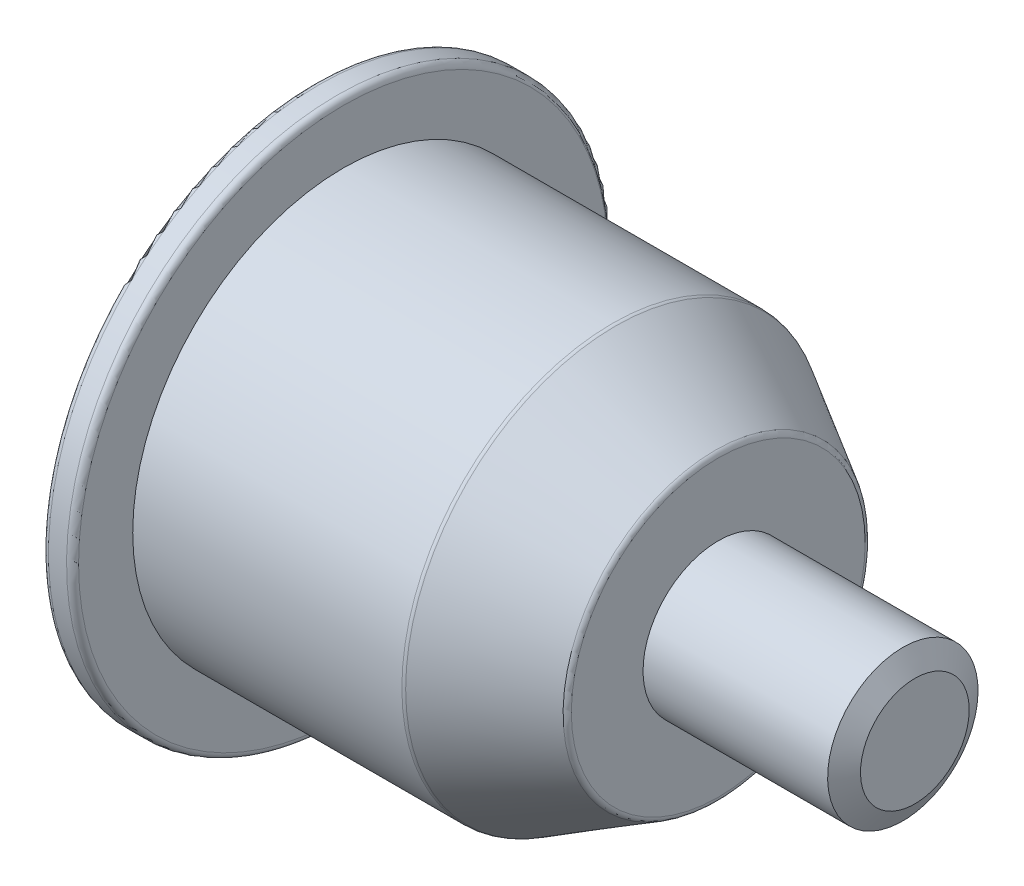
ISO-10303-21;
HEADER;
FILE_DESCRIPTION(('STEP AP214'),'2;1');
FILE_NAME('part.step','',(''),(''),'','','');
FILE_SCHEMA(('AUTOMOTIVE_DESIGN { 1 0 10303 214 1 1 1 1 }'));
ENDSEC;
DATA;
#1=APPLICATION_CONTEXT('core data for automotive mechanical design processes');
#2=APPLICATION_PROTOCOL_DEFINITION('international standard','automotive_design',2000,#1);
#3=PRODUCT_CONTEXT('',#1,'mechanical');
#4=PRODUCT('Part','Part','',(#3));
#5=PRODUCT_RELATED_PRODUCT_CATEGORY('part','',(#4));
#6=PRODUCT_DEFINITION_FORMATION('','',#4);
#7=PRODUCT_DEFINITION_CONTEXT('part definition',#1,'design');
#8=PRODUCT_DEFINITION('design','',#6,#7);
#9=PRODUCT_DEFINITION_SHAPE('','',#8);
#10=(LENGTH_UNIT() NAMED_UNIT(*) SI_UNIT(.MILLI.,.METRE.));
#11=(NAMED_UNIT(*) PLANE_ANGLE_UNIT() SI_UNIT($,.RADIAN.));
#12=(NAMED_UNIT(*) SI_UNIT($,.STERADIAN.) SOLID_ANGLE_UNIT());
#13=UNCERTAINTY_MEASURE_WITH_UNIT(LENGTH_MEASURE(1.E-05),#10,'distance_accuracy_value','');
#14=(GEOMETRIC_REPRESENTATION_CONTEXT(3) GLOBAL_UNCERTAINTY_ASSIGNED_CONTEXT((#13)) GLOBAL_UNIT_ASSIGNED_CONTEXT((#10,
#11,#12)) REPRESENTATION_CONTEXT('',''));
#15=CARTESIAN_POINT('',(0.,0.,0.));
#16=DIRECTION('',(0.,0.,1.));
#17=DIRECTION('',(1.,0.,0.));
#18=AXIS2_PLACEMENT_3D('',#15,#16,#17);
#19=CARTESIAN_POINT('',(0.,127.,0.));
#20=DIRECTION('',(-1.,0.,0.));
#21=DIRECTION('',(0.,-1.,0.));
#22=AXIS2_PLACEMENT_3D('',#19,#20,#21);
#23=PLANE('',#22);
#24=CARTESIAN_POINT('',(0.,0.,0.));
#25=DIRECTION('',(-1.,0.,0.));
#26=DIRECTION('',(0.,-1.,0.));
#27=AXIS2_PLACEMENT_3D('',#24,#25,#26);
#28=CIRCLE('',#27,139.7);
#29=CARTESIAN_POINT('',(0.,-139.7,0.));
#30=VERTEX_POINT('',#29);
#31=EDGE_CURVE('E51',#30,#30,#28,.F.);
#32=ORIENTED_EDGE('',*,*,#31,.T.);
#33=EDGE_LOOP('',(#32));
#34=FACE_BOUND('',#33,.T.);
#35=CARTESIAN_POINT('',(0.,0.,0.));
#36=DIRECTION('',(-1.,0.,0.));
#37=DIRECTION('',(0.,-1.,0.));
#38=AXIS2_PLACEMENT_3D('',#35,#36,#37);
#39=CIRCLE('',#38,223.52);
#40=CARTESIAN_POINT('',(0.,-223.52,0.));
#41=VERTEX_POINT('',#40);
#42=EDGE_CURVE('E77',#41,#41,#39,.T.);
#43=ORIENTED_EDGE('',*,*,#42,.T.);
#44=EDGE_LOOP('',(#43));
#45=FACE_BOUND('',#44,.T.);
#46=ADVANCED_FACE('F39',(#34,#45),#23,.T.);
#47=CARTESIAN_POINT('',(508.,0.,0.));
#48=DIRECTION('',(1.,0.,0.));
#49=DIRECTION('',(0.,1.,0.));
#50=AXIS2_PLACEMENT_3D('',#47,#48,#49);
#51=CYLINDRICAL_SURFACE('',#50,228.6);
#52=CARTESIAN_POINT('',(20.32,0.,0.));
#53=DIRECTION('',(1.,0.,0.));
#54=DIRECTION('',(0.,1.,0.));
#55=AXIS2_PLACEMENT_3D('',#52,#53,#54);
#56=CIRCLE('',#55,228.6);
#57=CARTESIAN_POINT('',(20.32,228.6,0.));
#58=VERTEX_POINT('',#57);
#59=EDGE_CURVE('E81',#58,#58,#56,.F.);
#60=ORIENTED_EDGE('',*,*,#59,.T.);
#61=EDGE_LOOP('',(#60));
#62=FACE_BOUND('',#61,.T.);
#63=CARTESIAN_POINT('',(5.07999999999997,0.,0.));
#64=DIRECTION('',(-1.,0.,0.));
#65=DIRECTION('',(0.,-1.,0.));
#66=AXIS2_PLACEMENT_3D('',#63,#64,#65);
#67=CIRCLE('',#66,228.6);
#68=CARTESIAN_POINT('',(5.07999999999997,-228.6,0.));
#69=VERTEX_POINT('',#68);
#70=EDGE_CURVE('E83',#69,#69,#67,.F.);
#71=ORIENTED_EDGE('',*,*,#70,.T.);
#72=EDGE_LOOP('',(#71));
#73=FACE_BOUND('',#72,.T.);
#74=ADVANCED_FACE('F130',(#62,#73),#51,.T.);
#75=CARTESIAN_POINT('',(25.4,228.6,0.));
#76=DIRECTION('',(1.,0.,0.));
#77=DIRECTION('',(0.,1.,0.));
#78=AXIS2_PLACEMENT_3D('',#75,#76,#77);
#79=PLANE('',#78);
#80=CARTESIAN_POINT('',(25.4,0.,0.));
#81=DIRECTION('',(1.,0.,0.));
#82=DIRECTION('',(0.,1.,0.));
#83=AXIS2_PLACEMENT_3D('',#80,#81,#82);
#84=CIRCLE('',#83,223.52);
#85=CARTESIAN_POINT('',(25.4,223.52,0.));
#86=VERTEX_POINT('',#85);
#87=EDGE_CURVE('E87',#86,#86,#84,.T.);
#88=ORIENTED_EDGE('',*,*,#87,.T.);
#89=EDGE_LOOP('',(#88));
#90=FACE_BOUND('',#89,.T.);
#91=CARTESIAN_POINT('',(25.4,0.,0.));
#92=DIRECTION('',(1.,0.,0.));
#93=DIRECTION('',(0.,1.,0.));
#94=AXIS2_PLACEMENT_3D('',#91,#92,#93);
#95=CIRCLE('',#94,177.8);
#96=CARTESIAN_POINT('',(25.4,177.8,0.));
#97=VERTEX_POINT('',#96);
#98=EDGE_CURVE('E105',#97,#97,#95,.T.);
#99=ORIENTED_EDGE('',*,*,#98,.F.);
#100=EDGE_LOOP('',(#99));
#101=FACE_BOUND('',#100,.T.);
#102=ADVANCED_FACE('F134',(#90,#101),#79,.T.);
#103=CARTESIAN_POINT('',(508.,0.,0.));
#104=DIRECTION('',(1.,0.,0.));
#105=DIRECTION('',(0.,1.,0.));
#106=AXIS2_PLACEMENT_3D('',#103,#104,#105);
#107=CYLINDRICAL_SURFACE('',#106,177.8);
#108=CARTESIAN_POINT('',(252.63881810245,0.,0.));
#109=DIRECTION('',(-1.,0.,0.));
#110=DIRECTION('',(0.,-1.,0.));
#111=AXIS2_PLACEMENT_3D('',#108,#109,#110);
#112=CIRCLE('',#111,177.8);
#113=CARTESIAN_POINT('',(252.63881810245,-177.8,0.));
#114=VERTEX_POINT('',#113);
#115=EDGE_CURVE('E89',#114,#114,#112,.T.);
#116=ORIENTED_EDGE('',*,*,#115,.T.);
#117=EDGE_LOOP('',(#116));
#118=FACE_BOUND('',#117,.T.);
#119=ORIENTED_EDGE('',*,*,#98,.T.);
#120=EDGE_LOOP('',(#119));
#121=FACE_BOUND('',#120,.T.);
#122=ADVANCED_FACE('F122',(#118,#121),#107,.T.);
#123=CARTESIAN_POINT('',(341.988181024499,0.,0.));
#124=DIRECTION('',(-1.,0.,0.));
#125=DIRECTION('',(0.,-1.,0.));
#126=AXIS2_PLACEMENT_3D('',#123,#124,#125);
#127=CONICAL_SURFACE('',#126,127.,0.5235987755983);
#128=CARTESIAN_POINT('',(339.448181024499,0.,0.));
#129=DIRECTION('',(1.,0.,0.));
#130=DIRECTION('',(0.,1.,0.));
#131=AXIS2_PLACEMENT_3D('',#128,#129,#130);
#132=CIRCLE('',#131,128.466469683742);
#133=CARTESIAN_POINT('',(339.448181024499,128.466469683742,0.));
#134=VERTEX_POINT('',#133);
#135=EDGE_CURVE('E91',#134,#134,#132,.F.);
#136=ORIENTED_EDGE('',*,*,#135,.T.);
#137=EDGE_LOOP('',(#136));
#138=FACE_BOUND('',#137,.T.);
#139=CARTESIAN_POINT('',(255.17881810245,0.,0.));
#140=DIRECTION('',(1.,0.,0.));
#141=DIRECTION('',(0.,1.,0.));
#142=AXIS2_PLACEMENT_3D('',#139,#140,#141);
#143=CIRCLE('',#142,177.119409051225);
#144=CARTESIAN_POINT('',(255.17881810245,177.119409051225,0.));
#145=VERTEX_POINT('',#144);
#146=EDGE_CURVE('E96',#145,#145,#143,.T.);
#147=ORIENTED_EDGE('',*,*,#146,.T.);
#148=EDGE_LOOP('',(#147));
#149=FACE_BOUND('',#148,.T.);
#150=ADVANCED_FACE('F114',(#138,#149),#127,.T.);
#151=CARTESIAN_POINT('',(341.988181024499,63.5,0.));
#152=DIRECTION('',(1.,0.,0.));
#153=DIRECTION('',(0.,1.,0.));
#154=AXIS2_PLACEMENT_3D('',#151,#152,#153);
#155=PLANE('',#154);
#156=CARTESIAN_POINT('',(341.988181024499,0.,0.));
#157=DIRECTION('',(1.,0.,0.));
#158=DIRECTION('',(0.,1.,0.));
#159=AXIS2_PLACEMENT_3D('',#156,#157,#158);
#160=CIRCLE('',#159,124.067060632517);
#161=CARTESIAN_POINT('',(341.988181024499,124.067060632517,0.));
#162=VERTEX_POINT('',#161);
#163=EDGE_CURVE('E97',#162,#162,#160,.T.);
#164=ORIENTED_EDGE('',*,*,#163,.T.);
#165=EDGE_LOOP('',(#164));
#166=FACE_BOUND('',#165,.T.);
#167=CARTESIAN_POINT('',(341.988181024499,0.,0.));
#168=DIRECTION('',(1.,0.,0.));
#169=DIRECTION('',(0.,1.,0.));
#170=AXIS2_PLACEMENT_3D('',#167,#168,#169);
#171=CIRCLE('',#170,63.5);
#172=CARTESIAN_POINT('',(341.988181024499,63.5,0.));
#173=VERTEX_POINT('',#172);
#174=EDGE_CURVE('E104',#173,#173,#171,.T.);
#175=ORIENTED_EDGE('',*,*,#174,.F.);
#176=EDGE_LOOP('',(#175));
#177=FACE_BOUND('',#176,.T.);
#178=ADVANCED_FACE('F112',(#166,#177),#155,.T.);
#179=CARTESIAN_POINT('',(508.,0.,0.));
#180=DIRECTION('',(1.,0.,0.));
#181=DIRECTION('',(0.,1.,0.));
#182=AXIS2_PLACEMENT_3D('',#179,#180,#181);
#183=CYLINDRICAL_SURFACE('',#182,63.5);
#184=CARTESIAN_POINT('',(497.84,0.,0.));
#185=DIRECTION('',(1.,0.,0.));
#186=DIRECTION('',(0.,1.,0.));
#187=AXIS2_PLACEMENT_3D('',#184,#185,#186);
#188=CIRCLE('',#187,63.5);
#189=CARTESIAN_POINT('',(497.84,63.5,0.));
#190=VERTEX_POINT('',#189);
#191=EDGE_CURVE('E10',#190,#190,#188,.F.);
#192=ORIENTED_EDGE('',*,*,#191,.T.);
#193=EDGE_LOOP('',(#192));
#194=FACE_BOUND('',#193,.T.);
#195=ORIENTED_EDGE('',*,*,#174,.T.);
#196=EDGE_LOOP('',(#195));
#197=FACE_BOUND('',#196,.T.);
#198=ADVANCED_FACE('F108',(#194,#197),#183,.T.);
#199=CARTESIAN_POINT('',(508.,63.5,0.));
#200=DIRECTION('',(1.,0.,0.));
#201=DIRECTION('',(0.,1.,0.));
#202=AXIS2_PLACEMENT_3D('',#199,#200,#201);
#203=PLANE('',#202);
#204=CARTESIAN_POINT('',(508.,0.,0.));
#205=DIRECTION('',(1.,0.,0.));
#206=DIRECTION('',(0.,1.,0.));
#207=AXIS2_PLACEMENT_3D('',#204,#205,#206);
#208=CIRCLE('',#207,45.9023637951005);
#209=CARTESIAN_POINT('',(508.,45.9023637951005,0.));
#210=VERTEX_POINT('',#209);
#211=EDGE_CURVE('E50',#210,#210,#208,.T.);
#212=ORIENTED_EDGE('',*,*,#211,.T.);
#213=EDGE_LOOP('',(#212));
#214=FACE_BOUND('',#213,.T.);
#215=ADVANCED_FACE('F121',(#214),#203,.T.);
#216=CARTESIAN_POINT('',(279.4,0.,0.));
#217=DIRECTION('',(-1.,0.,0.));
#218=DIRECTION('',(0.,-1.,0.));
#219=AXIS2_PLACEMENT_3D('',#216,#217,#218);
#220=PLANE('',#219);
#221=CARTESIAN_POINT('',(279.4,0.,0.));
#222=DIRECTION('',(-1.,0.,0.));
#223=DIRECTION('',(0.,-1.,0.));
#224=AXIS2_PLACEMENT_3D('',#221,#222,#223);
#225=CIRCLE('',#224,50.8);
#226=CARTESIAN_POINT('',(279.4,-50.8,0.));
#227=VERTEX_POINT('',#226);
#228=EDGE_CURVE('E68',#227,#227,#225,.T.);
#229=ORIENTED_EDGE('',*,*,#228,.T.);
#230=EDGE_LOOP('',(#229));
#231=FACE_BOUND('',#230,.T.);
#232=ADVANCED_FACE('F191',(#231),#220,.T.);
#233=CARTESIAN_POINT('',(508.,0.,0.));
#234=DIRECTION('',(1.,0.,0.));
#235=DIRECTION('',(0.,1.,0.));
#236=AXIS2_PLACEMENT_3D('',#233,#234,#235);
#237=CYLINDRICAL_SURFACE('',#236,63.5);
#238=CARTESIAN_POINT('',(266.7,0.,0.));
#239=DIRECTION('',(-1.,0.,0.));
#240=DIRECTION('',(0.,-1.,0.));
#241=AXIS2_PLACEMENT_3D('',#238,#239,#240);
#242=CIRCLE('',#241,63.5);
#243=CARTESIAN_POINT('',(266.7,-63.5,0.));
#244=VERTEX_POINT('',#243);
#245=EDGE_CURVE('E75',#244,#244,#242,.F.);
#246=ORIENTED_EDGE('',*,*,#245,.T.);
#247=EDGE_LOOP('',(#246));
#248=FACE_BOUND('',#247,.T.);
#249=CARTESIAN_POINT('',(165.1,0.,0.));
#250=DIRECTION('',(-1.,0.,0.));
#251=DIRECTION('',(0.,-1.,0.));
#252=AXIS2_PLACEMENT_3D('',#249,#250,#251);
#253=CIRCLE('',#252,63.5);
#254=CARTESIAN_POINT('',(165.1,-63.5,0.));
#255=VERTEX_POINT('',#254);
#256=EDGE_CURVE('E73',#255,#255,#253,.T.);
#257=ORIENTED_EDGE('',*,*,#256,.T.);
#258=EDGE_LOOP('',(#257));
#259=FACE_BOUND('',#258,.T.);
#260=ADVANCED_FACE('F183',(#248,#259),#237,.F.);
#261=CARTESIAN_POINT('',(152.4,63.5,0.));
#262=DIRECTION('',(-1.,0.,0.));
#263=DIRECTION('',(0.,-1.,0.));
#264=AXIS2_PLACEMENT_3D('',#261,#262,#263);
#265=PLANE('',#264);
#266=CARTESIAN_POINT('',(152.4,0.,0.));
#267=DIRECTION('',(-1.,0.,0.));
#268=DIRECTION('',(0.,-1.,0.));
#269=AXIS2_PLACEMENT_3D('',#266,#267,#268);
#270=CIRCLE('',#269,76.2);
#271=CARTESIAN_POINT('',(152.4,-76.2,0.));
#272=VERTEX_POINT('',#271);
#273=EDGE_CURVE('E62',#272,#272,#270,.F.);
#274=ORIENTED_EDGE('',*,*,#273,.T.);
#275=EDGE_LOOP('',(#274));
#276=FACE_BOUND('',#275,.T.);
#277=CARTESIAN_POINT('',(152.4,0.,0.));
#278=DIRECTION('',(-1.,0.,0.));
#279=DIRECTION('',(0.,-1.,0.));
#280=AXIS2_PLACEMENT_3D('',#277,#278,#279);
#281=CIRCLE('',#280,114.3);
#282=CARTESIAN_POINT('',(152.4,-114.3,0.));
#283=VERTEX_POINT('',#282);
#284=EDGE_CURVE('E66',#283,#283,#281,.T.);
#285=ORIENTED_EDGE('',*,*,#284,.T.);
#286=EDGE_LOOP('',(#285));
#287=FACE_BOUND('',#286,.T.);
#288=ADVANCED_FACE('F178',(#276,#287),#265,.T.);
#289=CARTESIAN_POINT('',(508.,0.,0.));
#290=DIRECTION('',(1.,0.,0.));
#291=DIRECTION('',(0.,1.,0.));
#292=AXIS2_PLACEMENT_3D('',#289,#290,#291);
#293=CYLINDRICAL_SURFACE('',#292,127.);
#294=CARTESIAN_POINT('',(139.7,0.,0.));
#295=DIRECTION('',(-1.,0.,0.));
#296=DIRECTION('',(0.,-1.,0.));
#297=AXIS2_PLACEMENT_3D('',#294,#295,#296);
#298=CIRCLE('',#297,127.);
#299=CARTESIAN_POINT('',(139.7,-127.,0.));
#300=VERTEX_POINT('',#299);
#301=EDGE_CURVE('E54',#300,#300,#298,.F.);
#302=ORIENTED_EDGE('',*,*,#301,.T.);
#303=EDGE_LOOP('',(#302));
#304=FACE_BOUND('',#303,.T.);
#305=CARTESIAN_POINT('',(12.7,0.,0.));
#306=DIRECTION('',(-1.,0.,0.));
#307=DIRECTION('',(0.,-1.,0.));
#308=AXIS2_PLACEMENT_3D('',#305,#306,#307);
#309=CIRCLE('',#308,127.);
#310=CARTESIAN_POINT('',(12.7,-127.,0.));
#311=VERTEX_POINT('',#310);
#312=EDGE_CURVE('E58',#311,#311,#309,.T.);
#313=ORIENTED_EDGE('',*,*,#312,.T.);
#314=EDGE_LOOP('',(#313));
#315=FACE_BOUND('',#314,.T.);
#316=ADVANCED_FACE('F145',(#304,#315),#293,.F.);
#317=CARTESIAN_POINT('',(336.908181024499,0.,0.));
#318=DIRECTION('',(1.,0.,0.));
#319=DIRECTION('',(0.,1.,0.));
#320=AXIS2_PLACEMENT_3D('',#317,#318,#319);
#321=TOROIDAL_SURFACE('',#320,124.067060632517,5.08);
#322=ORIENTED_EDGE('',*,*,#135,.F.);
#323=EDGE_LOOP('',(#322));
#324=FACE_BOUND('',#323,.T.);
#325=ORIENTED_EDGE('',*,*,#163,.F.);
#326=EDGE_LOOP('',(#325));
#327=FACE_BOUND('',#326,.T.);
#328=ADVANCED_FACE('F143',(#324,#327),#321,.T.);
#329=CARTESIAN_POINT('',(252.63881810245,0.,0.));
#330=DIRECTION('',(-1.,0.,0.));
#331=DIRECTION('',(0.,-1.,0.));
#332=AXIS2_PLACEMENT_3D('',#329,#330,#331);
#333=TOROIDAL_SURFACE('',#332,172.72,5.08);
#334=ORIENTED_EDGE('',*,*,#115,.F.);
#335=EDGE_LOOP('',(#334));
#336=FACE_BOUND('',#335,.T.);
#337=ORIENTED_EDGE('',*,*,#146,.F.);
#338=EDGE_LOOP('',(#337));
#339=FACE_BOUND('',#338,.T.);
#340=ADVANCED_FACE('F141',(#336,#339),#333,.T.);
#341=CARTESIAN_POINT('',(20.32,0.,0.));
#342=DIRECTION('',(1.,0.,0.));
#343=DIRECTION('',(0.,1.,0.));
#344=AXIS2_PLACEMENT_3D('',#341,#342,#343);
#345=TOROIDAL_SURFACE('',#344,223.52,5.08);
#346=ORIENTED_EDGE('',*,*,#59,.F.);
#347=EDGE_LOOP('',(#346));
#348=FACE_BOUND('',#347,.T.);
#349=ORIENTED_EDGE('',*,*,#87,.F.);
#350=EDGE_LOOP('',(#349));
#351=FACE_BOUND('',#350,.T.);
#352=ADVANCED_FACE('F146',(#348,#351),#345,.T.);
#353=CARTESIAN_POINT('',(5.07999999999997,0.,0.));
#354=DIRECTION('',(-1.,0.,0.));
#355=DIRECTION('',(0.,-1.,0.));
#356=AXIS2_PLACEMENT_3D('',#353,#354,#355);
#357=TOROIDAL_SURFACE('',#356,223.52,5.08);
#358=ORIENTED_EDGE('',*,*,#42,.F.);
#359=EDGE_LOOP('',(#358));
#360=FACE_BOUND('',#359,.T.);
#361=ORIENTED_EDGE('',*,*,#70,.F.);
#362=EDGE_LOOP('',(#361));
#363=FACE_BOUND('',#362,.T.);
#364=ADVANCED_FACE('F155',(#360,#363),#357,.T.);
#365=CARTESIAN_POINT('',(266.7,0.,0.));
#366=DIRECTION('',(-1.,0.,0.));
#367=DIRECTION('',(0.,-1.,0.));
#368=AXIS2_PLACEMENT_3D('',#365,#366,#367);
#369=TOROIDAL_SURFACE('',#368,50.8,12.7);
#370=ORIENTED_EDGE('',*,*,#228,.F.);
#371=EDGE_LOOP('',(#370));
#372=FACE_BOUND('',#371,.T.);
#373=ORIENTED_EDGE('',*,*,#245,.F.);
#374=EDGE_LOOP('',(#373));
#375=FACE_BOUND('',#374,.T.);
#376=ADVANCED_FACE('F154',(#372,#375),#369,.F.);
#377=CARTESIAN_POINT('',(165.1,0.,0.));
#378=DIRECTION('',(-1.,0.,0.));
#379=DIRECTION('',(0.,-1.,0.));
#380=AXIS2_PLACEMENT_3D('',#377,#378,#379);
#381=TOROIDAL_SURFACE('',#380,76.2,12.7);
#382=ORIENTED_EDGE('',*,*,#256,.F.);
#383=EDGE_LOOP('',(#382));
#384=FACE_BOUND('',#383,.T.);
#385=ORIENTED_EDGE('',*,*,#273,.F.);
#386=EDGE_LOOP('',(#385));
#387=FACE_BOUND('',#386,.T.);
#388=ADVANCED_FACE('F157',(#384,#387),#381,.T.);
#389=CARTESIAN_POINT('',(139.7,0.,0.));
#390=DIRECTION('',(-1.,0.,0.));
#391=DIRECTION('',(0.,-1.,0.));
#392=AXIS2_PLACEMENT_3D('',#389,#390,#391);
#393=TOROIDAL_SURFACE('',#392,114.3,12.7);
#394=ORIENTED_EDGE('',*,*,#284,.F.);
#395=EDGE_LOOP('',(#394));
#396=FACE_BOUND('',#395,.T.);
#397=ORIENTED_EDGE('',*,*,#301,.F.);
#398=EDGE_LOOP('',(#397));
#399=FACE_BOUND('',#398,.T.);
#400=ADVANCED_FACE('F162',(#396,#399),#393,.F.);
#401=CARTESIAN_POINT('',(12.7,0.,0.));
#402=DIRECTION('',(-1.,0.,0.));
#403=DIRECTION('',(0.,-1.,0.));
#404=AXIS2_PLACEMENT_3D('',#401,#402,#403);
#405=TOROIDAL_SURFACE('',#404,139.7,12.7);
#406=ORIENTED_EDGE('',*,*,#312,.F.);
#407=EDGE_LOOP('',(#406));
#408=FACE_BOUND('',#407,.T.);
#409=ORIENTED_EDGE('',*,*,#31,.F.);
#410=EDGE_LOOP('',(#409));
#411=FACE_BOUND('',#410,.T.);
#412=ADVANCED_FACE('F167',(#408,#411),#405,.T.);
#413=CARTESIAN_POINT('',(508.,0.,0.));
#414=DIRECTION('',(-1.,0.,0.));
#415=DIRECTION('',(0.,-1.,0.));
#416=AXIS2_PLACEMENT_3D('',#413,#414,#415);
#417=CONICAL_SURFACE('',#416,45.9023637951005,1.04719755119659);
#418=ORIENTED_EDGE('',*,*,#191,.F.);
#419=EDGE_LOOP('',(#418));
#420=FACE_BOUND('',#419,.T.);
#421=ORIENTED_EDGE('',*,*,#211,.F.);
#422=EDGE_LOOP('',(#421));
#423=FACE_BOUND('',#422,.T.);
#424=ADVANCED_FACE('F45',(#420,#423),#417,.T.);
#425=CLOSED_SHELL('',(#46,#74,#102,#122,#150,#178,#198,#215,#232,#260,#288,#316,#328,#340,#352,
#364,#376,#388,#400,#412,#424));
#426=MANIFOLD_SOLID_BREP('B2',#425);
#427=ADVANCED_BREP_SHAPE_REPRESENTATION('',(#18,#426),#14);
#428=SHAPE_DEFINITION_REPRESENTATION(#9,#427);
ENDSEC;
END-ISO-10303-21;
